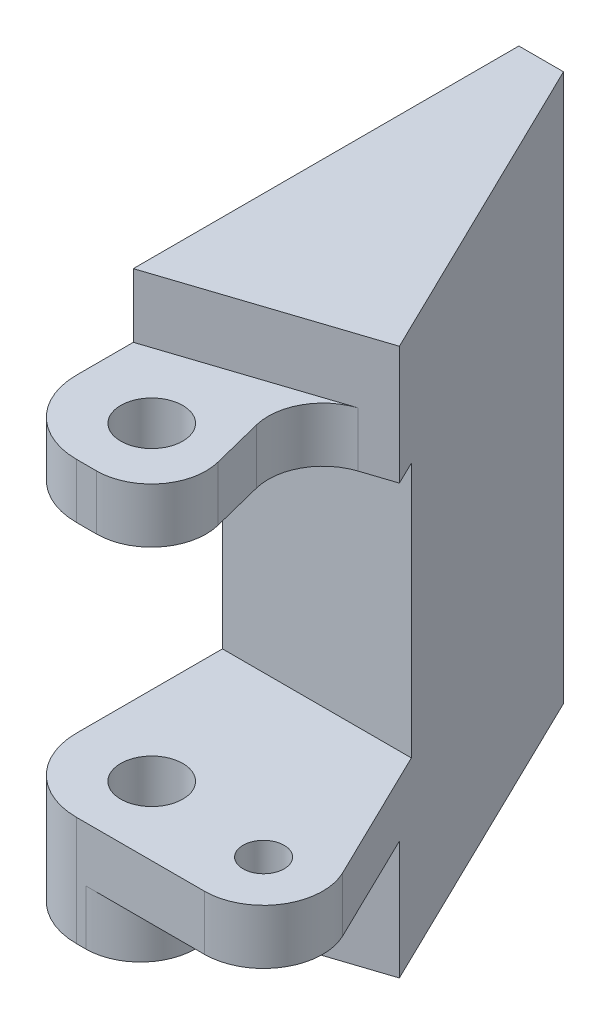
ISO-10303-21;
HEADER;
FILE_DESCRIPTION(('STEP AP214'),'2;1');
FILE_NAME('part.step','',(''),(''),'','','');
FILE_SCHEMA(('AUTOMOTIVE_DESIGN { 1 0 10303 214 1 1 1 1 }'));
ENDSEC;
DATA;
#1=APPLICATION_CONTEXT('core data for automotive mechanical design processes');
#2=APPLICATION_PROTOCOL_DEFINITION('international standard','automotive_design',2000,#1);
#3=PRODUCT_CONTEXT('',#1,'mechanical');
#4=PRODUCT('Part','Part','',(#3));
#5=PRODUCT_RELATED_PRODUCT_CATEGORY('part','',(#4));
#6=PRODUCT_DEFINITION_FORMATION('','',#4);
#7=PRODUCT_DEFINITION_CONTEXT('part definition',#1,'design');
#8=PRODUCT_DEFINITION('design','',#6,#7);
#9=PRODUCT_DEFINITION_SHAPE('','',#8);
#10=(LENGTH_UNIT() NAMED_UNIT(*) SI_UNIT(.MILLI.,.METRE.));
#11=(NAMED_UNIT(*) PLANE_ANGLE_UNIT() SI_UNIT($,.RADIAN.));
#12=(NAMED_UNIT(*) SI_UNIT($,.STERADIAN.) SOLID_ANGLE_UNIT());
#13=UNCERTAINTY_MEASURE_WITH_UNIT(LENGTH_MEASURE(1.E-05),#10,'distance_accuracy_value','');
#14=(GEOMETRIC_REPRESENTATION_CONTEXT(3) GLOBAL_UNCERTAINTY_ASSIGNED_CONTEXT((#13)) GLOBAL_UNIT_ASSIGNED_CONTEXT((#10,
#11,#12)) REPRESENTATION_CONTEXT('',''));
#15=CARTESIAN_POINT('',(0.,0.,0.));
#16=DIRECTION('',(0.,0.,1.));
#17=DIRECTION('',(1.,0.,0.));
#18=AXIS2_PLACEMENT_3D('',#15,#16,#17);
#19=CARTESIAN_POINT('',(-56.4024160397321,30.,-64.7427979788842));
#20=DIRECTION('',(0.,-1.,0.));
#21=DIRECTION('',(0.,0.,-1.));
#22=AXIS2_PLACEMENT_3D('',#19,#20,#21);
#23=CYLINDRICAL_SURFACE('',#22,3.24281672850294);
#24=CARTESIAN_POINT('',(-56.4024160397321,6.5,-64.7427979788842));
#25=DIRECTION('',(0.,-1.,0.));
#26=DIRECTION('',(0.,0.,-1.));
#27=AXIS2_PLACEMENT_3D('',#24,#25,#26);
#28=CIRCLE('',#27,3.24281672850294);
#29=CARTESIAN_POINT('',(-53.4866389733609,6.5,-66.161989450773));
#30=VERTEX_POINT('',#29);
#31=CARTESIAN_POINT('',(-56.4024160397321,6.5,-61.4999812503813));
#32=VERTEX_POINT('',#31);
#33=EDGE_CURVE('E411',#30,#32,#28,.T.);
#34=ORIENTED_EDGE('',*,*,#33,.F.);
#35=DIRECTION('',(0.,-1.,0.));
#36=VECTOR('',#35,1.);
#37=CARTESIAN_POINT('',(-53.4866389733609,30.,-66.161989450773));
#38=LINE('',#37,#36);
#39=CARTESIAN_POINT('',(-53.4866389733609,9.5,-66.161989450773));
#40=VERTEX_POINT('',#39);
#41=EDGE_CURVE('E263',#40,#30,#38,.T.);
#42=ORIENTED_EDGE('',*,*,#41,.F.);
#43=CARTESIAN_POINT('',(-56.4024160397321,9.5,-64.7427979788842));
#44=DIRECTION('',(0.,-1.,0.));
#45=DIRECTION('',(0.,0.,-1.));
#46=AXIS2_PLACEMENT_3D('',#43,#44,#45);
#47=CIRCLE('',#46,3.24281672850294);
#48=CARTESIAN_POINT('',(-56.4024160397321,9.5,-61.4999812503813));
#49=VERTEX_POINT('',#48);
#50=EDGE_CURVE('E365',#40,#49,#47,.T.);
#51=ORIENTED_EDGE('',*,*,#50,.T.);
#52=DIRECTION('',(0.,-1.,0.));
#53=VECTOR('',#52,1.);
#54=CARTESIAN_POINT('',(-56.4024160397321,30.,-61.4999812503813));
#55=LINE('',#54,#53);
#56=EDGE_CURVE('E266',#49,#32,#55,.T.);
#57=ORIENTED_EDGE('',*,*,#56,.T.);
#58=EDGE_LOOP('',(#34,#42,#51,#57));
#59=FACE_BOUND('',#58,.T.);
#60=ADVANCED_FACE('F33',(#59),#23,.T.);
#61=CARTESIAN_POINT('',(-56.4024160397321,30.,-64.7427979788842));
#62=DIRECTION('',(0.,-1.,0.));
#63=DIRECTION('',(0.,0.,-1.));
#64=AXIS2_PLACEMENT_3D('',#61,#62,#63);
#65=CYLINDRICAL_SURFACE('',#64,1.125);
#66=CARTESIAN_POINT('',(-56.4024160397321,9.5,-64.7427979788842));
#67=DIRECTION('',(0.,-1.,0.));
#68=DIRECTION('',(0.,0.,-1.));
#69=AXIS2_PLACEMENT_3D('',#66,#67,#68);
#70=CIRCLE('',#69,1.125);
#71=CARTESIAN_POINT('',(-56.4024160397321,9.5,-65.8677979788842));
#72=VERTEX_POINT('',#71);
#73=EDGE_CURVE('E370',#72,#72,#70,.T.);
#74=ORIENTED_EDGE('',*,*,#73,.F.);
#75=EDGE_LOOP('',(#74));
#76=FACE_BOUND('',#75,.T.);
#77=CARTESIAN_POINT('',(-56.4024160397321,6.5,-64.7427979788842));
#78=DIRECTION('',(0.,-1.,0.));
#79=DIRECTION('',(0.,0.,-1.));
#80=AXIS2_PLACEMENT_3D('',#77,#78,#79);
#81=CIRCLE('',#80,1.125);
#82=CARTESIAN_POINT('',(-56.4024160397321,6.5,-65.8677979788842));
#83=VERTEX_POINT('',#82);
#84=EDGE_CURVE('E408',#83,#83,#81,.T.);
#85=ORIENTED_EDGE('',*,*,#84,.T.);
#86=EDGE_LOOP('',(#85));
#87=FACE_BOUND('',#86,.T.);
#88=ADVANCED_FACE('F466',(#76,#87),#65,.F.);
#89=CARTESIAN_POINT('',(-67.4172671903647,30.,-61.4999812503813));
#90=DIRECTION('',(0.,0.,-1.));
#91=DIRECTION('',(-1.,0.,0.));
#92=AXIS2_PLACEMENT_3D('',#89,#90,#91);
#93=PLANE('',#92);
#94=DIRECTION('',(1.,0.,0.));
#95=VECTOR('',#94,1.);
#96=CARTESIAN_POINT('',(-67.4172671903647,23.5,-61.4999812503813));
#97=LINE('',#96,#95);
#98=CARTESIAN_POINT('',(-63.4172671903647,23.5,-61.4999812503813));
#99=VERTEX_POINT('',#98);
#100=CARTESIAN_POINT('',(-62.313261377346,23.5,-61.4999812503813));
#101=VERTEX_POINT('',#100);
#102=EDGE_CURVE('E204',#99,#101,#97,.T.);
#103=ORIENTED_EDGE('',*,*,#102,.T.);
#104=DIRECTION('',(0.,1.,0.));
#105=VECTOR('',#104,1.);
#106=CARTESIAN_POINT('',(-62.313261377346,30.,-61.4999812503813));
#107=LINE('',#106,#105);
#108=CARTESIAN_POINT('',(-62.313261377346,26.5,-61.4999812503813));
#109=VERTEX_POINT('',#108);
#110=EDGE_CURVE('E307',#101,#109,#107,.T.);
#111=ORIENTED_EDGE('',*,*,#110,.T.);
#112=DIRECTION('',(1.,0.,0.));
#113=VECTOR('',#112,1.);
#114=CARTESIAN_POINT('',(-67.4172671903647,26.5,-61.4999812503813));
#115=LINE('',#114,#113);
#116=CARTESIAN_POINT('',(-63.4172671903647,26.5,-61.4999812503813));
#117=VERTEX_POINT('',#116);
#118=EDGE_CURVE('E219',#117,#109,#115,.T.);
#119=ORIENTED_EDGE('',*,*,#118,.F.);
#120=DIRECTION('',(0.,-1.,0.));
#121=VECTOR('',#120,1.);
#122=CARTESIAN_POINT('',(-63.4172671903647,30.,-61.4999812503813));
#123=LINE('',#122,#121);
#124=EDGE_CURVE('E271',#117,#99,#123,.T.);
#125=ORIENTED_EDGE('',*,*,#124,.T.);
#126=EDGE_LOOP('',(#103,#111,#119,#125));
#127=FACE_BOUND('',#126,.T.);
#128=ADVANCED_FACE('F338',(#127),#93,.F.);
#129=CARTESIAN_POINT('',(-63.0669670897273,30.,-65.2736029297688));
#130=DIRECTION('',(0.,-1.,0.));
#131=DIRECTION('',(0.,0.,-1.));
#132=AXIS2_PLACEMENT_3D('',#129,#130,#131);
#133=CYLINDRICAL_SURFACE('',#132,1.7);
#134=CARTESIAN_POINT('',(-63.0669670897273,23.5,-65.2736029297688));
#135=DIRECTION('',(0.,1.,0.));
#136=DIRECTION('',(0.,0.,1.));
#137=AXIS2_PLACEMENT_3D('',#134,#135,#136);
#138=CIRCLE('',#137,1.7);
#139=CARTESIAN_POINT('',(-63.0669670897273,23.5,-63.5736029297688));
#140=VERTEX_POINT('',#139);
#141=EDGE_CURVE('E203',#140,#140,#138,.T.);
#142=ORIENTED_EDGE('',*,*,#141,.F.);
#143=EDGE_LOOP('',(#142));
#144=FACE_BOUND('',#143,.T.);
#145=CARTESIAN_POINT('',(-63.0669670897273,26.5,-65.2736029297688));
#146=DIRECTION('',(0.,1.,0.));
#147=DIRECTION('',(0.,0.,1.));
#148=AXIS2_PLACEMENT_3D('',#145,#146,#147);
#149=CIRCLE('',#148,1.7);
#150=CARTESIAN_POINT('',(-63.0669670897273,26.5,-63.5736029297688));
#151=VERTEX_POINT('',#150);
#152=EDGE_CURVE('E215',#151,#151,#149,.T.);
#153=ORIENTED_EDGE('',*,*,#152,.T.);
#154=EDGE_LOOP('',(#153));
#155=FACE_BOUND('',#154,.T.);
#156=ADVANCED_FACE('F384',(#144,#155),#133,.F.);
#157=CARTESIAN_POINT('',(-63.4172671903647,30.,-65.4999812503813));
#158=DIRECTION('',(0.,-1.,0.));
#159=DIRECTION('',(0.,0.,-1.));
#160=AXIS2_PLACEMENT_3D('',#157,#158,#159);
#161=CYLINDRICAL_SURFACE('',#160,4.);
#162=CARTESIAN_POINT('',(-63.4172671903647,23.5,-65.4999812503813));
#163=DIRECTION('',(0.,1.,0.));
#164=DIRECTION('',(0.,0.,1.));
#165=AXIS2_PLACEMENT_3D('',#162,#163,#164);
#166=CIRCLE('',#165,4.);
#167=CARTESIAN_POINT('',(-67.4172671903647,23.5,-65.4999812503813));
#168=VERTEX_POINT('',#167);
#169=EDGE_CURVE('E284',#99,#168,#166,.F.);
#170=ORIENTED_EDGE('',*,*,#169,.F.);
#171=ORIENTED_EDGE('',*,*,#124,.F.);
#172=CARTESIAN_POINT('',(-63.4172671903647,26.5,-65.4999812503813));
#173=DIRECTION('',(0.,1.,0.));
#174=DIRECTION('',(0.,0.,1.));
#175=AXIS2_PLACEMENT_3D('',#172,#173,#174);
#176=CIRCLE('',#175,4.);
#177=CARTESIAN_POINT('',(-67.4172671903647,26.5,-65.4999812503813));
#178=VERTEX_POINT('',#177);
#179=EDGE_CURVE('E280',#178,#117,#176,.T.);
#180=ORIENTED_EDGE('',*,*,#179,.F.);
#181=DIRECTION('',(0.,-1.,0.));
#182=VECTOR('',#181,1.);
#183=CARTESIAN_POINT('',(-67.4172671903647,30.,-65.4999812503813));
#184=LINE('',#183,#182);
#185=EDGE_CURVE('E276',#168,#178,#184,.F.);
#186=ORIENTED_EDGE('',*,*,#185,.F.);
#187=EDGE_LOOP('',(#170,#171,#180,#186));
#188=FACE_BOUND('',#187,.T.);
#189=ADVANCED_FACE('F343',(#188),#161,.T.);
#190=DIRECTION('',(1.,0.,0.));
#191=VECTOR('',#190,1.);
#192=CARTESIAN_POINT('',(-67.4172671903647,3.5,-61.4999812503813));
#193=LINE('',#192,#191);
#194=CARTESIAN_POINT('',(-63.4172671903647,3.5,-61.4999812503813));
#195=VERTEX_POINT('',#194);
#196=CARTESIAN_POINT('',(-62.9098416150484,3.5,-61.4999812503813));
#197=VERTEX_POINT('',#196);
#198=EDGE_CURVE('E235',#195,#197,#193,.T.);
#199=ORIENTED_EDGE('',*,*,#198,.T.);
#200=DIRECTION('',(0.,-1.,0.));
#201=VECTOR('',#200,1.);
#202=CARTESIAN_POINT('',(-62.9098416150484,30.,-61.4999812503813));
#203=LINE('',#202,#201);
#204=CARTESIAN_POINT('',(-62.9098416150484,6.5,-61.4999812503813));
#205=VERTEX_POINT('',#204);
#206=EDGE_CURVE('E293',#197,#205,#203,.F.);
#207=ORIENTED_EDGE('',*,*,#206,.T.);
#208=DIRECTION('',(-1.,0.,0.));
#209=VECTOR('',#208,1.);
#210=CARTESIAN_POINT('',(-56.4024160397321,6.5,-61.4999812503813));
#211=LINE('',#210,#209);
#212=EDGE_CURVE('E434',#32,#205,#211,.T.);
#213=ORIENTED_EDGE('',*,*,#212,.F.);
#214=ORIENTED_EDGE('',*,*,#56,.F.);
#215=DIRECTION('',(-1.,0.,0.));
#216=VECTOR('',#215,1.);
#217=CARTESIAN_POINT('',(-67.4172671903647,9.5,-61.4999812503813));
#218=LINE('',#217,#216);
#219=CARTESIAN_POINT('',(-63.4172671903647,9.5,-61.4999812503813));
#220=VERTEX_POINT('',#219);
#221=EDGE_CURVE('E361',#49,#220,#218,.T.);
#222=ORIENTED_EDGE('',*,*,#221,.T.);
#223=EDGE_CURVE('E189',#220,#195,#123,.T.);
#224=ORIENTED_EDGE('',*,*,#223,.T.);
#225=EDGE_LOOP('',(#199,#207,#213,#214,#222,#224));
#226=FACE_BOUND('',#225,.T.);
#227=ADVANCED_FACE('F382',(#226),#93,.F.);
#228=CARTESIAN_POINT('',(-63.0669670897273,9.5,-65.2736029297688));
#229=DIRECTION('',(0.,-1.,0.));
#230=DIRECTION('',(0.,0.,-1.));
#231=AXIS2_PLACEMENT_3D('',#228,#229,#230);
#232=CIRCLE('',#231,1.7);
#233=CARTESIAN_POINT('',(-63.0669670897273,9.5,-66.9736029297688));
#234=VERTEX_POINT('',#233);
#235=EDGE_CURVE('E210',#234,#234,#232,.T.);
#236=ORIENTED_EDGE('',*,*,#235,.F.);
#237=EDGE_LOOP('',(#236));
#238=FACE_BOUND('',#237,.T.);
#239=CARTESIAN_POINT('',(-63.0669670897273,3.5,-65.2736029297688));
#240=DIRECTION('',(0.,1.,0.));
#241=DIRECTION('',(0.,0.,1.));
#242=AXIS2_PLACEMENT_3D('',#239,#240,#241);
#243=CIRCLE('',#242,1.7);
#244=CARTESIAN_POINT('',(-63.0669670897273,3.5,-63.5736029297688));
#245=VERTEX_POINT('',#244);
#246=EDGE_CURVE('E231',#245,#245,#243,.T.);
#247=ORIENTED_EDGE('',*,*,#246,.F.);
#248=EDGE_LOOP('',(#247));
#249=FACE_BOUND('',#248,.T.);
#250=ADVANCED_FACE('F378',(#238,#249),#133,.F.);
#251=CARTESIAN_POINT('',(-56.4024160397321,30.,-64.7427979788842));
#252=DIRECTION('',(0.,1.,0.));
#253=DIRECTION('',(0.,0.,1.));
#254=AXIS2_PLACEMENT_3D('',#251,#252,#253);
#255=PLANE('',#254);
#256=DIRECTION('',(-0.950006559983136,0.,0.312229940891338));
#257=VECTOR('',#256,1.);
#258=CARTESIAN_POINT('',(-67.2577422822087,30.,-68.6656377368031));
#259=LINE('',#258,#257);
#260=CARTESIAN_POINT('',(-56.4363225389697,30.,-72.2222144901803));
#261=VERTEX_POINT('',#260);
#262=CARTESIAN_POINT('',(-67.4172671903647,30.,-68.6132081486905));
#263=VERTEX_POINT('',#262);
#264=EDGE_CURVE('E207',#261,#263,#259,.T.);
#265=ORIENTED_EDGE('',*,*,#264,.F.);
#266=DIRECTION('',(-0.437641590847496,0.,-0.899149508124468));
#267=VECTOR('',#266,1.);
#268=CARTESIAN_POINT('',(-64.9697837550443,30.,-89.7545003046391));
#269=LINE('',#268,#267);
#270=CARTESIAN_POINT('',(-64.9697837550443,30.,-89.7545003046391));
#271=VERTEX_POINT('',#270);
#272=EDGE_CURVE('E187',#261,#271,#269,.T.);
#273=ORIENTED_EDGE('',*,*,#272,.T.);
#274=DIRECTION('',(-1.,0.,0.));
#275=VECTOR('',#274,1.);
#276=CARTESIAN_POINT('',(-67.4172671903647,30.,-89.7545003046391));
#277=LINE('',#276,#275);
#278=CARTESIAN_POINT('',(-67.4172671903647,30.,-89.7545003046391));
#279=VERTEX_POINT('',#278);
#280=EDGE_CURVE('E250',#271,#279,#277,.T.);
#281=ORIENTED_EDGE('',*,*,#280,.T.);
#282=DIRECTION('',(0.,0.,1.));
#283=VECTOR('',#282,1.);
#284=CARTESIAN_POINT('',(-67.4172671903647,30.,-89.7545003046391));
#285=LINE('',#284,#283);
#286=EDGE_CURVE('E245',#279,#263,#285,.T.);
#287=ORIENTED_EDGE('',*,*,#286,.T.);
#288=EDGE_LOOP('',(#265,#273,#281,#287));
#289=FACE_BOUND('',#288,.T.);
#290=ADVANCED_FACE('F381',(#289),#255,.T.);
#291=CARTESIAN_POINT('',(-56.4024160397321,0.,-64.7427979788842));
#292=DIRECTION('',(0.,1.,0.));
#293=DIRECTION('',(0.,0.,1.));
#294=AXIS2_PLACEMENT_3D('',#291,#292,#293);
#295=PLANE('',#294);
#296=DIRECTION('',(-0.437641590847496,0.,-0.899149508124468));
#297=VECTOR('',#296,1.);
#298=CARTESIAN_POINT('',(-64.9697837550443,0.,-89.7545003046391));
#299=LINE('',#298,#297);
#300=CARTESIAN_POINT('',(-56.4363225389697,0.,-72.2222144901803));
#301=VERTEX_POINT('',#300);
#302=CARTESIAN_POINT('',(-64.9697837550443,0.,-89.7545003046391));
#303=VERTEX_POINT('',#302);
#304=EDGE_CURVE('E255',#301,#303,#299,.T.);
#305=ORIENTED_EDGE('',*,*,#304,.F.);
#306=DIRECTION('',(0.950006559983136,0.,-0.312229940891337));
#307=VECTOR('',#306,1.);
#308=CARTESIAN_POINT('',(-56.3608547847707,0.,-72.2470177846262));
#309=LINE('',#308,#307);
#310=CARTESIAN_POINT('',(-67.4172671903647,0.,-68.6132081486905));
#311=VERTEX_POINT('',#310);
#312=EDGE_CURVE('E228',#311,#301,#309,.T.);
#313=ORIENTED_EDGE('',*,*,#312,.F.);
#314=DIRECTION('',(0.,0.,1.));
#315=VECTOR('',#314,1.);
#316=CARTESIAN_POINT('',(-67.4172671903647,0.,-89.7545003046391));
#317=LINE('',#316,#315);
#318=CARTESIAN_POINT('',(-67.4172671903647,0.,-89.7545003046391));
#319=VERTEX_POINT('',#318);
#320=EDGE_CURVE('E244',#319,#311,#317,.T.);
#321=ORIENTED_EDGE('',*,*,#320,.F.);
#322=DIRECTION('',(-1.,0.,0.));
#323=VECTOR('',#322,1.);
#324=CARTESIAN_POINT('',(-67.4172671903647,0.,-89.7545003046391));
#325=LINE('',#324,#323);
#326=EDGE_CURVE('E248',#303,#319,#325,.T.);
#327=ORIENTED_EDGE('',*,*,#326,.F.);
#328=EDGE_LOOP('',(#305,#313,#321,#327));
#329=FACE_BOUND('',#328,.T.);
#330=ADVANCED_FACE('F451',(#329),#295,.F.);
#331=CARTESIAN_POINT('',(-67.4172671903647,30.,-89.7545003046391));
#332=DIRECTION('',(1.,0.,0.));
#333=DIRECTION('',(0.,0.,-1.));
#334=AXIS2_PLACEMENT_3D('',#331,#332,#333);
#335=PLANE('',#334);
#336=DIRECTION('',(0.,-1.,0.));
#337=VECTOR('',#336,1.);
#338=CARTESIAN_POINT('',(-67.4172671903647,9.5,-73.4999812503813));
#339=LINE('',#338,#337);
#340=CARTESIAN_POINT('',(-67.4172671903647,23.5,-73.4999812503813));
#341=VERTEX_POINT('',#340);
#342=CARTESIAN_POINT('',(-67.4172671903647,9.5,-73.4999812503813));
#343=VERTEX_POINT('',#342);
#344=EDGE_CURVE('E353',#341,#343,#339,.T.);
#345=ORIENTED_EDGE('',*,*,#344,.F.);
#346=DIRECTION('',(0.,0.,-1.));
#347=VECTOR('',#346,1.);
#348=CARTESIAN_POINT('',(-67.4172671903647,23.5,-73.4999812503813));
#349=LINE('',#348,#347);
#350=EDGE_CURVE('E346',#168,#341,#349,.T.);
#351=ORIENTED_EDGE('',*,*,#350,.F.);
#352=ORIENTED_EDGE('',*,*,#185,.T.);
#353=DIRECTION('',(0.,0.,1.));
#354=VECTOR('',#353,1.);
#355=CARTESIAN_POINT('',(-67.4172671903647,26.5,-89.7545003046391));
#356=LINE('',#355,#354);
#357=CARTESIAN_POINT('',(-67.4172671903647,26.5,-68.6132081486905));
#358=VERTEX_POINT('',#357);
#359=EDGE_CURVE('E222',#358,#178,#356,.T.);
#360=ORIENTED_EDGE('',*,*,#359,.F.);
#361=DIRECTION('',(0.,1.,0.));
#362=VECTOR('',#361,1.);
#363=CARTESIAN_POINT('',(-67.4172671903647,30.,-68.6132081486905));
#364=LINE('',#363,#362);
#365=EDGE_CURVE('E225',#358,#263,#364,.T.);
#366=ORIENTED_EDGE('',*,*,#365,.T.);
#367=ORIENTED_EDGE('',*,*,#286,.F.);
#368=DIRECTION('',(0.,-1.,0.));
#369=VECTOR('',#368,1.);
#370=CARTESIAN_POINT('',(-67.4172671903647,30.,-89.7545003046391));
#371=LINE('',#370,#369);
#372=EDGE_CURVE('E252',#279,#319,#371,.T.);
#373=ORIENTED_EDGE('',*,*,#372,.T.);
#374=ORIENTED_EDGE('',*,*,#320,.T.);
#375=DIRECTION('',(0.,1.,0.));
#376=VECTOR('',#375,1.);
#377=CARTESIAN_POINT('',(-67.4172671903647,30.,-68.6132081486905));
#378=LINE('',#377,#376);
#379=CARTESIAN_POINT('',(-67.4172671903647,3.5,-68.6132081486904));
#380=VERTEX_POINT('',#379);
#381=EDGE_CURVE('E241',#311,#380,#378,.T.);
#382=ORIENTED_EDGE('',*,*,#381,.T.);
#383=DIRECTION('',(0.,0.,1.));
#384=VECTOR('',#383,1.);
#385=CARTESIAN_POINT('',(-67.4172671903647,3.5,-89.7545003046391));
#386=LINE('',#385,#384);
#387=CARTESIAN_POINT('',(-67.4172671903647,3.5,-65.4999812503813));
#388=VERTEX_POINT('',#387);
#389=EDGE_CURVE('E238',#380,#388,#386,.T.);
#390=ORIENTED_EDGE('',*,*,#389,.T.);
#391=CARTESIAN_POINT('',(-67.4172671903647,9.5,-65.4999812503813));
#392=VERTEX_POINT('',#391);
#393=EDGE_CURVE('E277',#388,#392,#184,.F.);
#394=ORIENTED_EDGE('',*,*,#393,.T.);
#395=DIRECTION('',(0.,0.,1.));
#396=VECTOR('',#395,1.);
#397=CARTESIAN_POINT('',(-67.4172671903647,9.5,-73.4999812503813));
#398=LINE('',#397,#396);
#399=EDGE_CURVE('E355',#343,#392,#398,.T.);
#400=ORIENTED_EDGE('',*,*,#399,.F.);
#401=EDGE_LOOP('',(#345,#351,#352,#360,#366,#367,#373,#374,#382,#390,#394,#400));
#402=FACE_BOUND('',#401,.T.);
#403=ADVANCED_FACE('F349',(#402),#335,.F.);
#404=CARTESIAN_POINT('',(-64.9697837550443,30.,-89.7545003046391));
#405=DIRECTION('',(-0.899149508124468,0.,0.437641590847496));
#406=DIRECTION('',(0.437641590847496,0.,0.899149508124468));
#407=AXIS2_PLACEMENT_3D('',#404,#405,#406);
#408=PLANE('',#407);
#409=DIRECTION('',(0.,-1.,0.));
#410=VECTOR('',#409,1.);
#411=CARTESIAN_POINT('',(-56.4363225389697,30.,-72.2222144901803));
#412=LINE('',#411,#410);
#413=CARTESIAN_POINT('',(-56.4363225389697,23.5,-72.2222144901803));
#414=VERTEX_POINT('',#413);
#415=EDGE_CURVE('E180',#261,#414,#412,.T.);
#416=ORIENTED_EDGE('',*,*,#415,.T.);
#417=DIRECTION('',(-0.437641590847496,0.,-0.899149508124468));
#418=VECTOR('',#417,1.);
#419=CARTESIAN_POINT('',(-64.9697837550443,23.5,-89.7545003046391));
#420=LINE('',#419,#418);
#421=CARTESIAN_POINT('',(-57.0582478946682,23.5,-73.4999812503813));
#422=VERTEX_POINT('',#421);
#423=EDGE_CURVE('E184',#414,#422,#420,.T.);
#424=ORIENTED_EDGE('',*,*,#423,.T.);
#425=DIRECTION('',(0.,-1.,0.));
#426=VECTOR('',#425,1.);
#427=CARTESIAN_POINT('',(-57.0582478946682,30.,-73.4999812503813));
#428=LINE('',#427,#426);
#429=CARTESIAN_POINT('',(-57.0582478946682,9.5,-73.4999812503813));
#430=VERTEX_POINT('',#429);
#431=EDGE_CURVE('E286',#422,#430,#428,.T.);
#432=ORIENTED_EDGE('',*,*,#431,.T.);
#433=DIRECTION('',(0.437641590847496,0.,0.899149508124468));
#434=VECTOR('',#433,1.);
#435=CARTESIAN_POINT('',(-64.9697837550443,9.5,-89.7545003046391));
#436=LINE('',#435,#434);
#437=EDGE_CURVE('E367',#430,#40,#436,.T.);
#438=ORIENTED_EDGE('',*,*,#437,.T.);
#439=ORIENTED_EDGE('',*,*,#41,.T.);
#440=DIRECTION('',(0.437641590847497,0.,0.899149508124468));
#441=VECTOR('',#440,1.);
#442=CARTESIAN_POINT('',(-56.4363225389698,6.5,-72.2222144901805));
#443=LINE('',#442,#441);
#444=CARTESIAN_POINT('',(-56.4363225389698,6.5,-72.2222144901805));
#445=VERTEX_POINT('',#444);
#446=EDGE_CURVE('E401',#445,#30,#443,.T.);
#447=ORIENTED_EDGE('',*,*,#446,.F.);
#448=DIRECTION('',(0.,-1.,0.));
#449=VECTOR('',#448,1.);
#450=CARTESIAN_POINT('',(-56.4363225389697,30.,-72.2222144901803));
#451=LINE('',#450,#449);
#452=EDGE_CURVE('E190',#445,#301,#451,.T.);
#453=ORIENTED_EDGE('',*,*,#452,.T.);
#454=ORIENTED_EDGE('',*,*,#304,.T.);
#455=DIRECTION('',(0.,-1.,0.));
#456=VECTOR('',#455,1.);
#457=CARTESIAN_POINT('',(-64.9697837550443,30.,-89.7545003046391));
#458=LINE('',#457,#456);
#459=EDGE_CURVE('E260',#271,#303,#458,.T.);
#460=ORIENTED_EDGE('',*,*,#459,.F.);
#461=ORIENTED_EDGE('',*,*,#272,.F.);
#462=EDGE_LOOP('',(#416,#424,#432,#438,#439,#447,#453,#454,#460,#461));
#463=FACE_BOUND('',#462,.T.);
#464=ADVANCED_FACE('F181',(#463),#408,.F.);
#465=CARTESIAN_POINT('',(-67.4172671903647,30.,-89.7545003046391));
#466=DIRECTION('',(0.,0.,1.));
#467=DIRECTION('',(1.,0.,0.));
#468=AXIS2_PLACEMENT_3D('',#465,#466,#467);
#469=PLANE('',#468);
#470=ORIENTED_EDGE('',*,*,#326,.T.);
#471=ORIENTED_EDGE('',*,*,#372,.F.);
#472=ORIENTED_EDGE('',*,*,#280,.F.);
#473=ORIENTED_EDGE('',*,*,#459,.T.);
#474=EDGE_LOOP('',(#470,#471,#472,#473));
#475=FACE_BOUND('',#474,.T.);
#476=ADVANCED_FACE('F455',(#475),#469,.F.);
#477=CARTESIAN_POINT('',(-56.3608547847707,3.5,-72.2470177846262));
#478=DIRECTION('',(-0.312229940891337,0.,-0.950006559983136));
#479=DIRECTION('',(-0.950006559983136,0.,0.312229940891337));
#480=AXIS2_PLACEMENT_3D('',#477,#478,#479);
#481=PLANE('',#480);
#482=DIRECTION('',(0.95000655998313,0.,-0.312229940891357));
#483=VECTOR('',#482,1.);
#484=CARTESIAN_POINT('',(-59.9098416150484,6.5,-71.0806048408447));
#485=LINE('',#484,#483);
#486=CARTESIAN_POINT('',(-57.8465314377225,6.5,-71.7587340684139));
#487=VERTEX_POINT('',#486);
#488=EDGE_CURVE('E399',#487,#445,#485,.T.);
#489=ORIENTED_EDGE('',*,*,#488,.F.);
#490=DIRECTION('',(0.,-1.,0.));
#491=VECTOR('',#490,1.);
#492=CARTESIAN_POINT('',(-57.8465314377224,3.5,-71.7587340684137));
#493=LINE('',#492,#491);
#494=CARTESIAN_POINT('',(-57.8465314377225,3.5,-71.7587340684139));
#495=VERTEX_POINT('',#494);
#496=EDGE_CURVE('E298',#487,#495,#493,.T.);
#497=ORIENTED_EDGE('',*,*,#496,.T.);
#498=DIRECTION('',(0.95000655998313,0.,-0.312229940891356));
#499=VECTOR('',#498,1.);
#500=CARTESIAN_POINT('',(-67.2577422822087,3.5,-68.6656377368031));
#501=LINE('',#500,#499);
#502=EDGE_CURVE('E229',#380,#495,#501,.T.);
#503=ORIENTED_EDGE('',*,*,#502,.F.);
#504=ORIENTED_EDGE('',*,*,#381,.F.);
#505=ORIENTED_EDGE('',*,*,#312,.T.);
#506=ORIENTED_EDGE('',*,*,#452,.F.);
#507=EDGE_LOOP('',(#489,#497,#503,#504,#505,#506));
#508=FACE_BOUND('',#507,.T.);
#509=ADVANCED_FACE('F390',(#508),#481,.F.);
#510=CARTESIAN_POINT('',(0.,3.5,0.));
#511=DIRECTION('',(0.,1.,0.));
#512=DIRECTION('',(0.,0.,1.));
#513=AXIS2_PLACEMENT_3D('',#510,#511,#512);
#514=PLANE('',#513);
#515=ORIENTED_EDGE('',*,*,#246,.T.);
#516=EDGE_LOOP('',(#515));
#517=FACE_BOUND('',#516,.T.);
#518=DIRECTION('',(0.,0.,-1.));
#519=VECTOR('',#518,1.);
#520=CARTESIAN_POINT('',(-59.9098416150484,3.5,-70.2009910134826));
#521=LINE('',#520,#519);
#522=CARTESIAN_POINT('',(-59.9098416150484,3.5,-64.4999812503813));
#523=VERTEX_POINT('',#522);
#524=CARTESIAN_POINT('',(-59.9098416150484,3.5,-68.9087143884643));
#525=VERTEX_POINT('',#524);
#526=EDGE_CURVE('E394',#523,#525,#521,.T.);
#527=ORIENTED_EDGE('',*,*,#526,.F.);
#528=CARTESIAN_POINT('',(-62.9098416150484,3.5,-64.4999812503813));
#529=DIRECTION('',(0.,1.,0.));
#530=DIRECTION('',(0.,0.,1.));
#531=AXIS2_PLACEMENT_3D('',#528,#529,#530);
#532=CIRCLE('',#531,3.);
#533=EDGE_CURVE('E291',#523,#197,#532,.F.);
#534=ORIENTED_EDGE('',*,*,#533,.T.);
#535=ORIENTED_EDGE('',*,*,#198,.F.);
#536=CARTESIAN_POINT('',(-63.4172671903647,3.5,-65.4999812503813));
#537=DIRECTION('',(0.,1.,0.));
#538=DIRECTION('',(0.,0.,1.));
#539=AXIS2_PLACEMENT_3D('',#536,#537,#538);
#540=CIRCLE('',#539,4.);
#541=EDGE_CURVE('E274',#195,#388,#540,.F.);
#542=ORIENTED_EDGE('',*,*,#541,.T.);
#543=ORIENTED_EDGE('',*,*,#389,.F.);
#544=ORIENTED_EDGE('',*,*,#502,.T.);
#545=CARTESIAN_POINT('',(-56.9098416150484,3.5,-68.9087143884643));
#546=DIRECTION('',(0.,1.,0.));
#547=DIRECTION('',(0.,0.,1.));
#548=AXIS2_PLACEMENT_3D('',#545,#546,#547);
#549=CIRCLE('',#548,3.);
#550=EDGE_CURVE('E197',#495,#525,#549,.T.);
#551=ORIENTED_EDGE('',*,*,#550,.T.);
#552=EDGE_LOOP('',(#527,#534,#535,#542,#543,#544,#551));
#553=FACE_BOUND('',#552,.T.);
#554=ADVANCED_FACE('F387',(#517,#553),#514,.F.);
#555=CARTESIAN_POINT('',(-67.2577422822087,26.5,-68.6656377368031));
#556=DIRECTION('',(-0.312229940891338,0.,-0.950006559983136));
#557=DIRECTION('',(-0.950006559983136,0.,0.312229940891338));
#558=AXIS2_PLACEMENT_3D('',#555,#556,#557);
#559=PLANE('',#558);
#560=DIRECTION('',(-0.950006559983136,0.,0.312229940891337));
#561=VECTOR('',#560,1.);
#562=CARTESIAN_POINT('',(-56.3608547847707,26.5,-72.2470177846262));
#563=LINE('',#562,#561);
#564=CARTESIAN_POINT('',(-58.1477771142446,26.5,-71.6597264154814));
#565=VERTEX_POINT('',#564);
#566=EDGE_CURVE('E48',#565,#358,#563,.T.);
#567=ORIENTED_EDGE('',*,*,#566,.F.);
#568=DIRECTION('',(0.,1.,0.));
#569=VECTOR('',#568,1.);
#570=CARTESIAN_POINT('',(-58.1477771142446,23.5,-71.6597264154814));
#571=LINE('',#570,#569);
#572=CARTESIAN_POINT('',(-58.1477771142446,23.5,-71.6597264154813));
#573=VERTEX_POINT('',#572);
#574=EDGE_CURVE('E53',#565,#573,#571,.F.);
#575=ORIENTED_EDGE('',*,*,#574,.T.);
#576=DIRECTION('',(-0.950006559983138,0.,0.312229940891332));
#577=VECTOR('',#576,1.);
#578=CARTESIAN_POINT('',(-53.1000271796582,23.5,-73.3187240793902));
#579=LINE('',#578,#577);
#580=EDGE_CURVE('E192',#414,#573,#579,.T.);
#581=ORIENTED_EDGE('',*,*,#580,.F.);
#582=ORIENTED_EDGE('',*,*,#415,.F.);
#583=ORIENTED_EDGE('',*,*,#264,.T.);
#584=ORIENTED_EDGE('',*,*,#365,.F.);
#585=EDGE_LOOP('',(#567,#575,#581,#582,#583,#584));
#586=FACE_BOUND('',#585,.T.);
#587=ADVANCED_FACE('F193',(#586),#559,.F.);
#588=CARTESIAN_POINT('',(0.,26.5,0.));
#589=DIRECTION('',(0.,1.,0.));
#590=DIRECTION('',(0.,0.,1.));
#591=AXIS2_PLACEMENT_3D('',#588,#589,#590);
#592=PLANE('',#591);
#593=ORIENTED_EDGE('',*,*,#118,.T.);
#594=CARTESIAN_POINT('',(-62.313261377346,26.5,-64.4999812503813));
#595=DIRECTION('',(0.,1.,0.));
#596=DIRECTION('',(0.,0.,1.));
#597=AXIS2_PLACEMENT_3D('',#594,#595,#596);
#598=CIRCLE('',#597,3.);
#599=CARTESIAN_POINT('',(-59.4040517101337,26.5,-65.2324422474305));
#600=VERTEX_POINT('',#599);
#601=EDGE_CURVE('E310',#109,#600,#598,.T.);
#602=ORIENTED_EDGE('',*,*,#601,.T.);
#603=DIRECTION('',(0.244153665683087,0.,0.969736555737439));
#604=VECTOR('',#603,1.);
#605=CARTESIAN_POINT('',(-60.8025891963946,26.5,-70.7871936831789));
#606=LINE('',#605,#604);
#607=CARTESIAN_POINT('',(-60.1202969587829,26.5,-68.0772457384827));
#608=VERTEX_POINT('',#607);
#609=EDGE_CURVE('E325',#608,#600,#606,.T.);
#610=ORIENTED_EDGE('',*,*,#609,.F.);
#611=CARTESIAN_POINT('',(-57.2110872915706,26.5,-68.8097067355319));
#612=DIRECTION('',(0.,1.,0.));
#613=DIRECTION('',(0.,0.,1.));
#614=AXIS2_PLACEMENT_3D('',#611,#612,#613);
#615=CIRCLE('',#614,3.);
#616=EDGE_CURVE('E41',#608,#565,#615,.F.);
#617=ORIENTED_EDGE('',*,*,#616,.T.);
#618=ORIENTED_EDGE('',*,*,#566,.T.);
#619=ORIENTED_EDGE('',*,*,#359,.T.);
#620=ORIENTED_EDGE('',*,*,#179,.T.);
#621=EDGE_LOOP('',(#593,#602,#610,#617,#618,#619,#620));
#622=FACE_BOUND('',#621,.T.);
#623=ORIENTED_EDGE('',*,*,#152,.F.);
#624=EDGE_LOOP('',(#623));
#625=FACE_BOUND('',#624,.T.);
#626=ADVANCED_FACE('F323',(#622,#625),#592,.T.);
#627=CARTESIAN_POINT('',(-63.4172671903647,9.5,-65.4999812503813));
#628=DIRECTION('',(0.,-1.,0.));
#629=DIRECTION('',(0.,0.,-1.));
#630=AXIS2_PLACEMENT_3D('',#627,#628,#629);
#631=CIRCLE('',#630,4.);
#632=EDGE_CURVE('E282',#392,#220,#631,.F.);
#633=ORIENTED_EDGE('',*,*,#632,.F.);
#634=ORIENTED_EDGE('',*,*,#393,.F.);
#635=ORIENTED_EDGE('',*,*,#541,.F.);
#636=ORIENTED_EDGE('',*,*,#223,.F.);
#637=EDGE_LOOP('',(#633,#634,#635,#636));
#638=FACE_BOUND('',#637,.T.);
#639=ADVANCED_FACE('F421',(#638),#161,.T.);
#640=CARTESIAN_POINT('',(-53.1595993112292,9.5,-73.4999812503813));
#641=DIRECTION('',(0.,0.,-1.));
#642=DIRECTION('',(-1.,0.,0.));
#643=AXIS2_PLACEMENT_3D('',#640,#641,#642);
#644=PLANE('',#643);
#645=DIRECTION('',(-1.,0.,0.));
#646=VECTOR('',#645,1.);
#647=CARTESIAN_POINT('',(-53.1595993112292,23.5,-73.4999812503813));
#648=LINE('',#647,#646);
#649=EDGE_CURVE('E202',#422,#341,#648,.T.);
#650=ORIENTED_EDGE('',*,*,#649,.T.);
#651=ORIENTED_EDGE('',*,*,#344,.T.);
#652=DIRECTION('',(-1.,0.,0.));
#653=VECTOR('',#652,1.);
#654=CARTESIAN_POINT('',(-53.1595993112292,9.5,-73.4999812503813));
#655=LINE('',#654,#653);
#656=EDGE_CURVE('E354',#430,#343,#655,.T.);
#657=ORIENTED_EDGE('',*,*,#656,.F.);
#658=ORIENTED_EDGE('',*,*,#431,.F.);
#659=EDGE_LOOP('',(#650,#651,#657,#658));
#660=FACE_BOUND('',#659,.T.);
#661=ADVANCED_FACE('F414',(#660),#644,.F.);
#662=CARTESIAN_POINT('',(-53.1595993112292,23.5,-73.4999812503813));
#663=DIRECTION('',(0.,1.,0.));
#664=DIRECTION('',(0.,0.,1.));
#665=AXIS2_PLACEMENT_3D('',#662,#663,#664);
#666=PLANE('',#665);
#667=ORIENTED_EDGE('',*,*,#141,.T.);
#668=EDGE_LOOP('',(#667));
#669=FACE_BOUND('',#668,.T.);
#670=ORIENTED_EDGE('',*,*,#580,.T.);
#671=CARTESIAN_POINT('',(-57.2110872915706,23.5,-68.8097067355319));
#672=DIRECTION('',(0.,1.,0.));
#673=DIRECTION('',(0.,0.,1.));
#674=AXIS2_PLACEMENT_3D('',#671,#672,#673);
#675=CIRCLE('',#674,3.);
#676=CARTESIAN_POINT('',(-60.1202969587829,23.5,-68.0772457384827));
#677=VERTEX_POINT('',#676);
#678=EDGE_CURVE('E11',#573,#677,#675,.T.);
#679=ORIENTED_EDGE('',*,*,#678,.T.);
#680=DIRECTION('',(0.244153665683088,0.,0.969736555737439));
#681=VECTOR('',#680,1.);
#682=CARTESIAN_POINT('',(-60.9892752600681,23.5,-71.5286787634228));
#683=LINE('',#682,#681);
#684=CARTESIAN_POINT('',(-59.4040517101337,23.5,-65.2324422474305));
#685=VERTEX_POINT('',#684);
#686=EDGE_CURVE('E196',#677,#685,#683,.T.);
#687=ORIENTED_EDGE('',*,*,#686,.T.);
#688=CARTESIAN_POINT('',(-62.313261377346,23.5,-64.4999812503813));
#689=DIRECTION('',(0.,1.,0.));
#690=DIRECTION('',(0.,0.,1.));
#691=AXIS2_PLACEMENT_3D('',#688,#689,#690);
#692=CIRCLE('',#691,3.);
#693=EDGE_CURVE('E316',#685,#101,#692,.F.);
#694=ORIENTED_EDGE('',*,*,#693,.T.);
#695=ORIENTED_EDGE('',*,*,#102,.F.);
#696=ORIENTED_EDGE('',*,*,#169,.T.);
#697=ORIENTED_EDGE('',*,*,#350,.T.);
#698=ORIENTED_EDGE('',*,*,#649,.F.);
#699=ORIENTED_EDGE('',*,*,#423,.F.);
#700=EDGE_LOOP('',(#670,#679,#687,#694,#695,#696,#697,#698,#699));
#701=FACE_BOUND('',#700,.T.);
#702=ADVANCED_FACE('F200',(#669,#701),#666,.F.);
#703=CARTESIAN_POINT('',(-53.1595993112292,9.5,-73.4999812503813));
#704=DIRECTION('',(0.,-1.,0.));
#705=DIRECTION('',(0.,0.,-1.));
#706=AXIS2_PLACEMENT_3D('',#703,#704,#705);
#707=PLANE('',#706);
#708=ORIENTED_EDGE('',*,*,#235,.T.);
#709=EDGE_LOOP('',(#708));
#710=FACE_BOUND('',#709,.T.);
#711=ORIENTED_EDGE('',*,*,#73,.T.);
#712=EDGE_LOOP('',(#711));
#713=FACE_BOUND('',#712,.T.);
#714=ORIENTED_EDGE('',*,*,#656,.T.);
#715=ORIENTED_EDGE('',*,*,#399,.T.);
#716=ORIENTED_EDGE('',*,*,#632,.T.);
#717=ORIENTED_EDGE('',*,*,#221,.F.);
#718=ORIENTED_EDGE('',*,*,#50,.F.);
#719=ORIENTED_EDGE('',*,*,#437,.F.);
#720=EDGE_LOOP('',(#714,#715,#716,#717,#718,#719));
#721=FACE_BOUND('',#720,.T.);
#722=ADVANCED_FACE('F375',(#710,#713,#721),#707,.F.);
#723=CARTESIAN_POINT('',(0.,6.5,0.));
#724=DIRECTION('',(0.,-1.,0.));
#725=DIRECTION('',(0.,0.,-1.));
#726=AXIS2_PLACEMENT_3D('',#723,#724,#725);
#727=PLANE('',#726);
#728=ORIENTED_EDGE('',*,*,#84,.F.);
#729=EDGE_LOOP('',(#728));
#730=FACE_BOUND('',#729,.T.);
#731=DIRECTION('',(0.,0.,-1.));
#732=VECTOR('',#731,1.);
#733=CARTESIAN_POINT('',(-59.9098416150484,6.5,-61.4999812503813));
#734=LINE('',#733,#732);
#735=CARTESIAN_POINT('',(-59.9098416150484,6.5,-64.4999812503813));
#736=VERTEX_POINT('',#735);
#737=CARTESIAN_POINT('',(-59.9098416150484,6.5,-68.9087143884643));
#738=VERTEX_POINT('',#737);
#739=EDGE_CURVE('E406',#736,#738,#734,.T.);
#740=ORIENTED_EDGE('',*,*,#739,.T.);
#741=CARTESIAN_POINT('',(-56.9098416150484,6.5,-68.9087143884643));
#742=DIRECTION('',(0.,-1.,0.));
#743=DIRECTION('',(0.,0.,-1.));
#744=AXIS2_PLACEMENT_3D('',#741,#742,#743);
#745=CIRCLE('',#744,3.);
#746=EDGE_CURVE('E303',#738,#487,#745,.T.);
#747=ORIENTED_EDGE('',*,*,#746,.T.);
#748=ORIENTED_EDGE('',*,*,#488,.T.);
#749=ORIENTED_EDGE('',*,*,#446,.T.);
#750=ORIENTED_EDGE('',*,*,#33,.T.);
#751=ORIENTED_EDGE('',*,*,#212,.T.);
#752=CARTESIAN_POINT('',(-62.9098416150484,6.5,-64.4999812503813));
#753=DIRECTION('',(0.,-1.,0.));
#754=DIRECTION('',(0.,0.,-1.));
#755=AXIS2_PLACEMENT_3D('',#752,#753,#754);
#756=CIRCLE('',#755,3.);
#757=EDGE_CURVE('E296',#205,#736,#756,.F.);
#758=ORIENTED_EDGE('',*,*,#757,.T.);
#759=EDGE_LOOP('',(#740,#747,#748,#749,#750,#751,#758));
#760=FACE_BOUND('',#759,.T.);
#761=ADVANCED_FACE('F433',(#730,#760),#727,.T.);
#762=CARTESIAN_POINT('',(-59.9098416150484,6.5,-70.2009910134826));
#763=DIRECTION('',(-1.,0.,0.));
#764=DIRECTION('',(0.,0.,1.));
#765=AXIS2_PLACEMENT_3D('',#762,#763,#764);
#766=PLANE('',#765);
#767=ORIENTED_EDGE('',*,*,#526,.T.);
#768=DIRECTION('',(0.,-1.,0.));
#769=VECTOR('',#768,1.);
#770=CARTESIAN_POINT('',(-59.9098416150484,6.5,-68.9087143884643));
#771=LINE('',#770,#769);
#772=EDGE_CURVE('E301',#525,#738,#771,.F.);
#773=ORIENTED_EDGE('',*,*,#772,.T.);
#774=ORIENTED_EDGE('',*,*,#739,.F.);
#775=DIRECTION('',(0.,-1.,0.));
#776=VECTOR('',#775,1.);
#777=CARTESIAN_POINT('',(-59.9098416150484,6.5,-64.4999812503813));
#778=LINE('',#777,#776);
#779=EDGE_CURVE('E288',#736,#523,#778,.T.);
#780=ORIENTED_EDGE('',*,*,#779,.T.);
#781=EDGE_LOOP('',(#767,#773,#774,#780));
#782=FACE_BOUND('',#781,.T.);
#783=ADVANCED_FACE('F485',(#782),#766,.F.);
#784=CARTESIAN_POINT('',(-62.9098416150484,6.5,-64.4999812503813));
#785=DIRECTION('',(0.,-1.,0.));
#786=DIRECTION('',(0.,0.,-1.));
#787=AXIS2_PLACEMENT_3D('',#784,#785,#786);
#788=CYLINDRICAL_SURFACE('',#787,3.);
#789=ORIENTED_EDGE('',*,*,#757,.F.);
#790=ORIENTED_EDGE('',*,*,#206,.F.);
#791=ORIENTED_EDGE('',*,*,#533,.F.);
#792=ORIENTED_EDGE('',*,*,#779,.F.);
#793=EDGE_LOOP('',(#789,#790,#791,#792));
#794=FACE_BOUND('',#793,.T.);
#795=ADVANCED_FACE('F482',(#794),#788,.T.);
#796=CARTESIAN_POINT('',(-56.9098416150484,3.5,-68.9087143884643));
#797=DIRECTION('',(0.,1.,0.));
#798=DIRECTION('',(0.,0.,1.));
#799=AXIS2_PLACEMENT_3D('',#796,#797,#798);
#800=CYLINDRICAL_SURFACE('',#799,3.);
#801=ORIENTED_EDGE('',*,*,#746,.F.);
#802=ORIENTED_EDGE('',*,*,#772,.F.);
#803=ORIENTED_EDGE('',*,*,#550,.F.);
#804=ORIENTED_EDGE('',*,*,#496,.F.);
#805=EDGE_LOOP('',(#801,#802,#803,#804));
#806=FACE_BOUND('',#805,.T.);
#807=ADVANCED_FACE('F443',(#806),#800,.F.);
#808=CARTESIAN_POINT('',(-60.8025891963946,16.5,-70.7871936831789));
#809=DIRECTION('',(-0.969736555737439,0.,0.244153665683087));
#810=DIRECTION('',(0.244153665683088,0.,0.969736555737439));
#811=AXIS2_PLACEMENT_3D('',#808,#809,#810);
#812=PLANE('',#811);
#813=ORIENTED_EDGE('',*,*,#686,.F.);
#814=DIRECTION('',(0.,1.,0.));
#815=VECTOR('',#814,1.);
#816=CARTESIAN_POINT('',(-60.1202969587829,26.5,-68.0772457384827));
#817=LINE('',#816,#815);
#818=EDGE_CURVE('E318',#677,#608,#817,.T.);
#819=ORIENTED_EDGE('',*,*,#818,.T.);
#820=ORIENTED_EDGE('',*,*,#609,.T.);
#821=DIRECTION('',(0.,1.,0.));
#822=VECTOR('',#821,1.);
#823=CARTESIAN_POINT('',(-59.4040517101337,16.5,-65.2324422474305));
#824=LINE('',#823,#822);
#825=EDGE_CURVE('E313',#600,#685,#824,.F.);
#826=ORIENTED_EDGE('',*,*,#825,.T.);
#827=EDGE_LOOP('',(#813,#819,#820,#826));
#828=FACE_BOUND('',#827,.T.);
#829=ADVANCED_FACE('F330',(#828),#812,.F.);
#830=CARTESIAN_POINT('',(-62.313261377346,30.,-64.4999812503813));
#831=DIRECTION('',(0.,1.,0.));
#832=DIRECTION('',(0.,0.,1.));
#833=AXIS2_PLACEMENT_3D('',#830,#831,#832);
#834=CYLINDRICAL_SURFACE('',#833,3.);
#835=ORIENTED_EDGE('',*,*,#693,.F.);
#836=ORIENTED_EDGE('',*,*,#825,.F.);
#837=ORIENTED_EDGE('',*,*,#601,.F.);
#838=ORIENTED_EDGE('',*,*,#110,.F.);
#839=EDGE_LOOP('',(#835,#836,#837,#838));
#840=FACE_BOUND('',#839,.T.);
#841=ADVANCED_FACE('F335',(#840),#834,.T.);
#842=CARTESIAN_POINT('',(-57.2110872915706,16.5,-68.8097067355319));
#843=DIRECTION('',(0.,-1.,0.));
#844=DIRECTION('',(0.,0.,-1.));
#845=AXIS2_PLACEMENT_3D('',#842,#843,#844);
#846=CYLINDRICAL_SURFACE('',#845,3.);
#847=ORIENTED_EDGE('',*,*,#678,.F.);
#848=ORIENTED_EDGE('',*,*,#574,.F.);
#849=ORIENTED_EDGE('',*,*,#616,.F.);
#850=ORIENTED_EDGE('',*,*,#818,.F.);
#851=EDGE_LOOP('',(#847,#848,#849,#850));
#852=FACE_BOUND('',#851,.T.);
#853=ADVANCED_FACE('F35',(#852),#846,.F.);
#854=CLOSED_SHELL('',(#60,#88,#128,#156,#189,#227,#250,#290,#330,#403,#464,#476,#509,#554,#587,
#626,#639,#661,#702,#722,#761,#783,#795,#807,#829,#841,#853));
#855=MANIFOLD_SOLID_BREP('B2',#854);
#856=ADVANCED_BREP_SHAPE_REPRESENTATION('',(#18,#855),#14);
#857=SHAPE_DEFINITION_REPRESENTATION(#9,#856);
ENDSEC;
END-ISO-10303-21;
